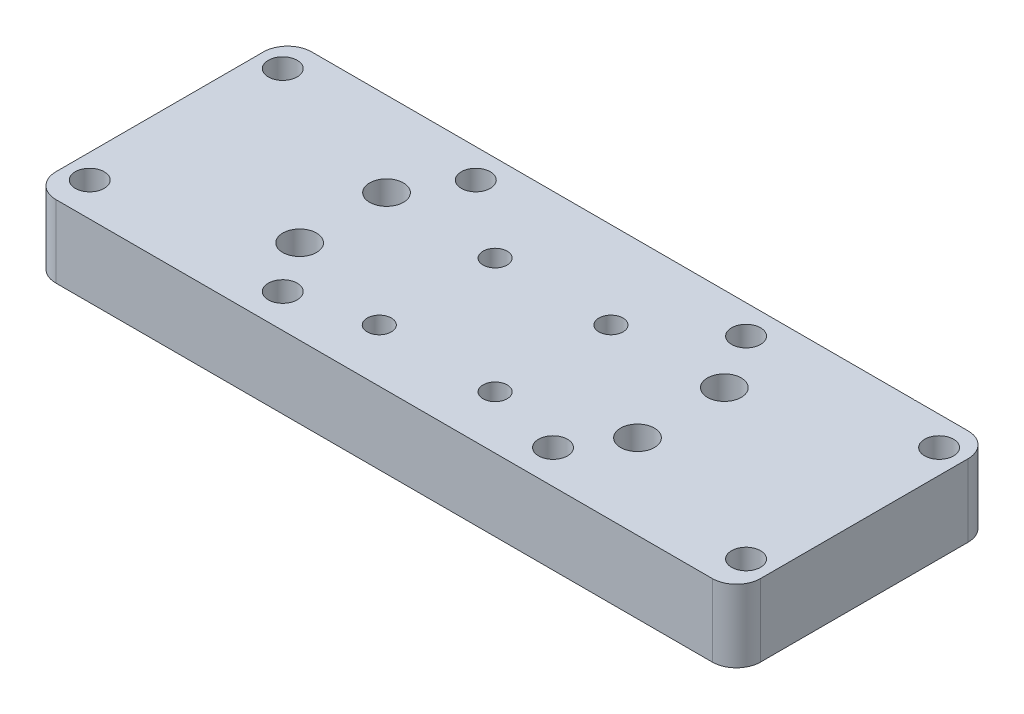
ISO-10303-21;
HEADER;
FILE_DESCRIPTION(('STEP AP214'),'2;1');
FILE_NAME('part.step','',(''),(''),'','','');
FILE_SCHEMA(('AUTOMOTIVE_DESIGN { 1 0 10303 214 1 1 1 1 }'));
ENDSEC;
DATA;
#1=APPLICATION_CONTEXT('core data for automotive mechanical design processes');
#2=APPLICATION_PROTOCOL_DEFINITION('international standard','automotive_design',2000,#1);
#3=PRODUCT_CONTEXT('',#1,'mechanical');
#4=PRODUCT('Part','Part','',(#3));
#5=PRODUCT_RELATED_PRODUCT_CATEGORY('part','',(#4));
#6=PRODUCT_DEFINITION_FORMATION('','',#4);
#7=PRODUCT_DEFINITION_CONTEXT('part definition',#1,'design');
#8=PRODUCT_DEFINITION('design','',#6,#7);
#9=PRODUCT_DEFINITION_SHAPE('','',#8);
#10=(LENGTH_UNIT() NAMED_UNIT(*) SI_UNIT(.MILLI.,.METRE.));
#11=(NAMED_UNIT(*) PLANE_ANGLE_UNIT() SI_UNIT($,.RADIAN.));
#12=(NAMED_UNIT(*) SI_UNIT($,.STERADIAN.) SOLID_ANGLE_UNIT());
#13=UNCERTAINTY_MEASURE_WITH_UNIT(LENGTH_MEASURE(1.E-05),#10,'distance_accuracy_value','');
#14=(GEOMETRIC_REPRESENTATION_CONTEXT(3) GLOBAL_UNCERTAINTY_ASSIGNED_CONTEXT((#13)) GLOBAL_UNIT_ASSIGNED_CONTEXT((#10,
#11,#12)) REPRESENTATION_CONTEXT('',''));
#15=CARTESIAN_POINT('',(0.,0.,0.));
#16=DIRECTION('',(0.,0.,1.));
#17=DIRECTION('',(1.,0.,0.));
#18=AXIS2_PLACEMENT_3D('',#15,#16,#17);
#19=CARTESIAN_POINT('',(0.,0.,0.));
#20=DIRECTION('',(0.,1.,0.));
#21=DIRECTION('',(0.,0.,1.));
#22=AXIS2_PLACEMENT_3D('',#19,#20,#21);
#23=PLANE('',#22);
#24=CARTESIAN_POINT('',(108.,0.,-27.5));
#25=DIRECTION('',(0.,1.,0.));
#26=DIRECTION('',(0.,0.,1.));
#27=AXIS2_PLACEMENT_3D('',#24,#25,#26);
#28=CIRCLE('',#27,3.50000000000001);
#29=CARTESIAN_POINT('',(108.,0.,-24.));
#30=VERTEX_POINT('',#29);
#31=EDGE_CURVE('E213',#30,#30,#28,.T.);
#32=ORIENTED_EDGE('',*,*,#31,.T.);
#33=EDGE_LOOP('',(#32));
#34=FACE_BOUND('',#33,.T.);
#35=CARTESIAN_POINT('',(108.,0.,-45.5));
#36=DIRECTION('',(0.,1.,0.));
#37=DIRECTION('',(0.,0.,1.));
#38=AXIS2_PLACEMENT_3D('',#35,#36,#37);
#39=CIRCLE('',#38,3.50000000000001);
#40=CARTESIAN_POINT('',(108.,0.,-42.));
#41=VERTEX_POINT('',#40);
#42=EDGE_CURVE('E216',#41,#41,#39,.T.);
#43=ORIENTED_EDGE('',*,*,#42,.T.);
#44=EDGE_LOOP('',(#43));
#45=FACE_BOUND('',#44,.T.);
#46=CARTESIAN_POINT('',(38.,0.,-27.5));
#47=DIRECTION('',(0.,1.,0.));
#48=DIRECTION('',(0.,0.,1.));
#49=AXIS2_PLACEMENT_3D('',#46,#47,#48);
#50=CIRCLE('',#49,3.5);
#51=CARTESIAN_POINT('',(38.,0.,-24.));
#52=VERTEX_POINT('',#51);
#53=EDGE_CURVE('E219',#52,#52,#50,.T.);
#54=ORIENTED_EDGE('',*,*,#53,.T.);
#55=EDGE_LOOP('',(#54));
#56=FACE_BOUND('',#55,.T.);
#57=CARTESIAN_POINT('',(38.,0.,-45.5));
#58=DIRECTION('',(0.,1.,0.));
#59=DIRECTION('',(0.,0.,1.));
#60=AXIS2_PLACEMENT_3D('',#57,#58,#59);
#61=CIRCLE('',#60,3.5);
#62=CARTESIAN_POINT('',(38.,0.,-42.));
#63=VERTEX_POINT('',#62);
#64=EDGE_CURVE('E222',#63,#63,#61,.T.);
#65=ORIENTED_EDGE('',*,*,#64,.T.);
#66=EDGE_LOOP('',(#65));
#67=FACE_BOUND('',#66,.T.);
#68=CARTESIAN_POINT('',(85.,0.,-21.));
#69=DIRECTION('',(0.,1.,0.));
#70=DIRECTION('',(0.,0.,1.));
#71=AXIS2_PLACEMENT_3D('',#68,#69,#70);
#72=CIRCLE('',#71,2.5);
#73=CARTESIAN_POINT('',(85.,0.,-18.5));
#74=VERTEX_POINT('',#73);
#75=EDGE_CURVE('E225',#74,#74,#72,.T.);
#76=ORIENTED_EDGE('',*,*,#75,.T.);
#77=EDGE_LOOP('',(#76));
#78=FACE_BOUND('',#77,.T.);
#79=CARTESIAN_POINT('',(61.,0.,-21.));
#80=DIRECTION('',(0.,1.,0.));
#81=DIRECTION('',(0.,0.,1.));
#82=AXIS2_PLACEMENT_3D('',#79,#80,#81);
#83=CIRCLE('',#82,2.5);
#84=CARTESIAN_POINT('',(61.,0.,-18.5));
#85=VERTEX_POINT('',#84);
#86=EDGE_CURVE('E234',#85,#85,#83,.T.);
#87=ORIENTED_EDGE('',*,*,#86,.T.);
#88=EDGE_LOOP('',(#87));
#89=FACE_BOUND('',#88,.T.);
#90=CARTESIAN_POINT('',(85.,0.,-45.));
#91=DIRECTION('',(0.,1.,0.));
#92=DIRECTION('',(0.,0.,1.));
#93=AXIS2_PLACEMENT_3D('',#90,#91,#92);
#94=CIRCLE('',#93,2.5);
#95=CARTESIAN_POINT('',(85.,0.,-42.5));
#96=VERTEX_POINT('',#95);
#97=EDGE_CURVE('E228',#96,#96,#94,.T.);
#98=ORIENTED_EDGE('',*,*,#97,.T.);
#99=EDGE_LOOP('',(#98));
#100=FACE_BOUND('',#99,.T.);
#101=CARTESIAN_POINT('',(61.,0.,-45.));
#102=DIRECTION('',(0.,1.,0.));
#103=DIRECTION('',(0.,0.,1.));
#104=AXIS2_PLACEMENT_3D('',#101,#102,#103);
#105=CIRCLE('',#104,2.5);
#106=CARTESIAN_POINT('',(61.,0.,-42.5));
#107=VERTEX_POINT('',#106);
#108=EDGE_CURVE('E231',#107,#107,#105,.T.);
#109=ORIENTED_EDGE('',*,*,#108,.T.);
#110=EDGE_LOOP('',(#109));
#111=FACE_BOUND('',#110,.T.);
#112=CARTESIAN_POINT('',(5.,0.,-57.));
#113=DIRECTION('',(0.,1.,0.));
#114=DIRECTION('',(0.,0.,1.));
#115=AXIS2_PLACEMENT_3D('',#112,#113,#114);
#116=CIRCLE('',#115,3.);
#117=CARTESIAN_POINT('',(5.,0.,-54.));
#118=VERTEX_POINT('',#117);
#119=EDGE_CURVE('E262',#118,#118,#116,.T.);
#120=ORIENTED_EDGE('',*,*,#119,.T.);
#121=EDGE_LOOP('',(#120));
#122=FACE_BOUND('',#121,.T.);
#123=CARTESIAN_POINT('',(45.,0.,-57.));
#124=DIRECTION('',(0.,1.,0.));
#125=DIRECTION('',(0.,0.,1.));
#126=AXIS2_PLACEMENT_3D('',#123,#124,#125);
#127=CIRCLE('',#126,3.);
#128=CARTESIAN_POINT('',(45.,0.,-54.));
#129=VERTEX_POINT('',#128);
#130=EDGE_CURVE('E259',#129,#129,#127,.T.);
#131=ORIENTED_EDGE('',*,*,#130,.T.);
#132=EDGE_LOOP('',(#131));
#133=FACE_BOUND('',#132,.T.);
#134=CARTESIAN_POINT('',(5.,0.,-17.));
#135=DIRECTION('',(0.,1.,0.));
#136=DIRECTION('',(0.,0.,1.));
#137=AXIS2_PLACEMENT_3D('',#134,#135,#136);
#138=CIRCLE('',#137,3.);
#139=CARTESIAN_POINT('',(5.,0.,-14.));
#140=VERTEX_POINT('',#139);
#141=EDGE_CURVE('E256',#140,#140,#138,.T.);
#142=ORIENTED_EDGE('',*,*,#141,.T.);
#143=EDGE_LOOP('',(#142));
#144=FACE_BOUND('',#143,.T.);
#145=CARTESIAN_POINT('',(45.,0.,-17.));
#146=DIRECTION('',(0.,1.,0.));
#147=DIRECTION('',(0.,0.,1.));
#148=AXIS2_PLACEMENT_3D('',#145,#146,#147);
#149=CIRCLE('',#148,3.);
#150=CARTESIAN_POINT('',(45.,0.,-14.));
#151=VERTEX_POINT('',#150);
#152=EDGE_CURVE('E253',#151,#151,#149,.T.);
#153=ORIENTED_EDGE('',*,*,#152,.T.);
#154=EDGE_LOOP('',(#153));
#155=FACE_BOUND('',#154,.T.);
#156=CARTESIAN_POINT('',(101.,0.,-57.));
#157=DIRECTION('',(0.,1.,0.));
#158=DIRECTION('',(0.,0.,1.));
#159=AXIS2_PLACEMENT_3D('',#156,#157,#158);
#160=CIRCLE('',#159,3.00000000000001);
#161=CARTESIAN_POINT('',(101.,0.,-54.));
#162=VERTEX_POINT('',#161);
#163=EDGE_CURVE('E247',#162,#162,#160,.T.);
#164=ORIENTED_EDGE('',*,*,#163,.T.);
#165=EDGE_LOOP('',(#164));
#166=FACE_BOUND('',#165,.T.);
#167=CARTESIAN_POINT('',(101.,0.,-17.));
#168=DIRECTION('',(0.,1.,0.));
#169=DIRECTION('',(0.,0.,1.));
#170=AXIS2_PLACEMENT_3D('',#167,#168,#169);
#171=CIRCLE('',#170,3.00000000000001);
#172=CARTESIAN_POINT('',(101.,0.,-14.));
#173=VERTEX_POINT('',#172);
#174=EDGE_CURVE('E276',#173,#173,#171,.T.);
#175=ORIENTED_EDGE('',*,*,#174,.T.);
#176=EDGE_LOOP('',(#175));
#177=FACE_BOUND('',#176,.T.);
#178=CARTESIAN_POINT('',(141.,0.,-17.));
#179=DIRECTION('',(0.,1.,0.));
#180=DIRECTION('',(0.,0.,1.));
#181=AXIS2_PLACEMENT_3D('',#178,#179,#180);
#182=CIRCLE('',#181,2.99999999999999);
#183=CARTESIAN_POINT('',(141.,0.,-14.));
#184=VERTEX_POINT('',#183);
#185=EDGE_CURVE('E279',#184,#184,#182,.T.);
#186=ORIENTED_EDGE('',*,*,#185,.T.);
#187=EDGE_LOOP('',(#186));
#188=FACE_BOUND('',#187,.T.);
#189=CARTESIAN_POINT('',(141.,0.,-57.));
#190=DIRECTION('',(0.,1.,0.));
#191=DIRECTION('',(0.,0.,1.));
#192=AXIS2_PLACEMENT_3D('',#189,#190,#191);
#193=CIRCLE('',#192,2.99999999999999);
#194=CARTESIAN_POINT('',(141.,0.,-54.));
#195=VERTEX_POINT('',#194);
#196=EDGE_CURVE('E242',#195,#195,#193,.T.);
#197=ORIENTED_EDGE('',*,*,#196,.T.);
#198=EDGE_LOOP('',(#197));
#199=FACE_BOUND('',#198,.T.);
#200=DIRECTION('',(-1.,0.,0.));
#201=VECTOR('',#200,1.);
#202=CARTESIAN_POINT('',(160.,0.,-63.));
#203=LINE('',#202,#201);
#204=CARTESIAN_POINT('',(141.,0.,-63.));
#205=VERTEX_POINT('',#204);
#206=CARTESIAN_POINT('',(130.,0.,-63.));
#207=VERTEX_POINT('',#206);
#208=EDGE_CURVE('E249',#205,#207,#203,.T.);
#209=ORIENTED_EDGE('',*,*,#208,.F.);
#210=CARTESIAN_POINT('',(141.,0.,-58.));
#211=DIRECTION('',(0.,1.,0.));
#212=DIRECTION('',(0.,0.,1.));
#213=AXIS2_PLACEMENT_3D('',#210,#211,#212);
#214=CIRCLE('',#213,5.);
#215=CARTESIAN_POINT('',(146.,0.,-58.));
#216=VERTEX_POINT('',#215);
#217=EDGE_CURVE('E294',#205,#216,#214,.F.);
#218=ORIENTED_EDGE('',*,*,#217,.T.);
#219=DIRECTION('',(0.,0.,-1.));
#220=VECTOR('',#219,1.);
#221=CARTESIAN_POINT('',(146.,0.,-10.));
#222=LINE('',#221,#220);
#223=CARTESIAN_POINT('',(146.,0.,-15.));
#224=VERTEX_POINT('',#223);
#225=EDGE_CURVE('E239',#224,#216,#222,.T.);
#226=ORIENTED_EDGE('',*,*,#225,.F.);
#227=CARTESIAN_POINT('',(141.,0.,-15.));
#228=DIRECTION('',(0.,1.,0.));
#229=DIRECTION('',(0.,0.,1.));
#230=AXIS2_PLACEMENT_3D('',#227,#228,#229);
#231=CIRCLE('',#230,5.);
#232=CARTESIAN_POINT('',(141.,0.,-10.));
#233=VERTEX_POINT('',#232);
#234=EDGE_CURVE('E292',#224,#233,#231,.F.);
#235=ORIENTED_EDGE('',*,*,#234,.T.);
#236=DIRECTION('',(-1.,0.,0.));
#237=VECTOR('',#236,1.);
#238=CARTESIAN_POINT('',(0.,0.,-10.));
#239=LINE('',#238,#237);
#240=CARTESIAN_POINT('',(5.,0.,-10.));
#241=VERTEX_POINT('',#240);
#242=EDGE_CURVE('E251',#233,#241,#239,.T.);
#243=ORIENTED_EDGE('',*,*,#242,.T.);
#244=CARTESIAN_POINT('',(5.,0.,-15.));
#245=DIRECTION('',(0.,1.,0.));
#246=DIRECTION('',(0.,0.,1.));
#247=AXIS2_PLACEMENT_3D('',#244,#245,#246);
#248=CIRCLE('',#247,5.);
#249=CARTESIAN_POINT('',(0.,0.,-15.));
#250=VERTEX_POINT('',#249);
#251=EDGE_CURVE('E59',#241,#250,#248,.F.);
#252=ORIENTED_EDGE('',*,*,#251,.T.);
#253=DIRECTION('',(0.,0.,1.));
#254=VECTOR('',#253,1.);
#255=CARTESIAN_POINT('',(0.,0.,-63.));
#256=LINE('',#255,#254);
#257=CARTESIAN_POINT('',(0.,0.,-58.));
#258=VERTEX_POINT('',#257);
#259=EDGE_CURVE('E237',#258,#250,#256,.T.);
#260=ORIENTED_EDGE('',*,*,#259,.F.);
#261=CARTESIAN_POINT('',(5.,0.,-58.));
#262=DIRECTION('',(0.,1.,0.));
#263=DIRECTION('',(0.,0.,1.));
#264=AXIS2_PLACEMENT_3D('',#261,#262,#263);
#265=CIRCLE('',#264,5.);
#266=CARTESIAN_POINT('',(5.,0.,-63.));
#267=VERTEX_POINT('',#266);
#268=EDGE_CURVE('E53',#258,#267,#265,.F.);
#269=ORIENTED_EDGE('',*,*,#268,.T.);
#270=DIRECTION('',(1.,0.,0.));
#271=VECTOR('',#270,1.);
#272=CARTESIAN_POINT('',(0.,0.,-63.));
#273=LINE('',#272,#271);
#274=CARTESIAN_POINT('',(129.9,0.,-63.));
#275=VERTEX_POINT('',#274);
#276=EDGE_CURVE('E125',#267,#275,#273,.T.);
#277=ORIENTED_EDGE('',*,*,#276,.T.);
#278=CARTESIAN_POINT('',(129.9,0.,-62.9));
#279=DIRECTION('',(0.,1.,0.));
#280=DIRECTION('',(0.,0.,1.));
#281=AXIS2_PLACEMENT_3D('',#278,#279,#280);
#282=CIRCLE('',#281,0.1);
#283=CARTESIAN_POINT('',(130.,0.,-62.9));
#284=VERTEX_POINT('',#283);
#285=EDGE_CURVE('E270',#275,#284,#282,.F.);
#286=ORIENTED_EDGE('',*,*,#285,.T.);
#287=DIRECTION('',(0.,0.,-1.));
#288=VECTOR('',#287,1.);
#289=CARTESIAN_POINT('',(130.,0.,-10.));
#290=LINE('',#289,#288);
#291=EDGE_CURVE('E243',#284,#207,#290,.T.);
#292=ORIENTED_EDGE('',*,*,#291,.T.);
#293=EDGE_LOOP('',(#209,#218,#226,#235,#243,#252,#260,#269,#277,#286,#292));
#294=FACE_BOUND('',#293,.T.);
#295=ADVANCED_FACE('F38',(#34,#45,#56,#67,#78,#89,#100,#111,#122,#133,#144,#155,#166,#177,#188,
#199,#294),#23,.F.);
#296=CARTESIAN_POINT('',(0.,0.,-10.));
#297=DIRECTION('',(0.,0.,-1.));
#298=DIRECTION('',(-1.,0.,0.));
#299=AXIS2_PLACEMENT_3D('',#296,#297,#298);
#300=PLANE('',#299);
#301=ORIENTED_EDGE('',*,*,#242,.F.);
#302=DIRECTION('',(0.,-1.,0.));
#303=VECTOR('',#302,1.);
#304=CARTESIAN_POINT('',(141.,10.,-10.));
#305=LINE('',#304,#303);
#306=CARTESIAN_POINT('',(141.,15.,-10.));
#307=VERTEX_POINT('',#306);
#308=EDGE_CURVE('E298',#233,#307,#305,.F.);
#309=ORIENTED_EDGE('',*,*,#308,.T.);
#310=DIRECTION('',(1.,0.,0.));
#311=VECTOR('',#310,1.);
#312=CARTESIAN_POINT('',(0.,15.,-10.));
#313=LINE('',#312,#311);
#314=CARTESIAN_POINT('',(5.,15.,-10.));
#315=VERTEX_POINT('',#314);
#316=EDGE_CURVE('E153',#315,#307,#313,.T.);
#317=ORIENTED_EDGE('',*,*,#316,.F.);
#318=DIRECTION('',(0.,1.,0.));
#319=VECTOR('',#318,1.);
#320=CARTESIAN_POINT('',(5.,0.,-10.));
#321=LINE('',#320,#319);
#322=EDGE_CURVE('E296',#315,#241,#321,.F.);
#323=ORIENTED_EDGE('',*,*,#322,.T.);
#324=EDGE_LOOP('',(#301,#309,#317,#323));
#325=FACE_BOUND('',#324,.T.);
#326=ADVANCED_FACE('F309',(#325),#300,.F.);
#327=CARTESIAN_POINT('',(160.,10.,-63.));
#328=DIRECTION('',(0.,0.,1.));
#329=DIRECTION('',(1.,0.,0.));
#330=AXIS2_PLACEMENT_3D('',#327,#328,#329);
#331=PLANE('',#330);
#332=DIRECTION('',(0.,1.,0.));
#333=VECTOR('',#332,1.);
#334=CARTESIAN_POINT('',(130.,10.,-63.));
#335=LINE('',#334,#333);
#336=CARTESIAN_POINT('',(130.,15.,-63.));
#337=VERTEX_POINT('',#336);
#338=EDGE_CURVE('E246',#207,#337,#335,.T.);
#339=ORIENTED_EDGE('',*,*,#338,.T.);
#340=DIRECTION('',(-1.,0.,0.));
#341=VECTOR('',#340,1.);
#342=CARTESIAN_POINT('',(0.,15.,-63.));
#343=LINE('',#342,#341);
#344=CARTESIAN_POINT('',(141.,15.,-63.));
#345=VERTEX_POINT('',#344);
#346=EDGE_CURVE('E165',#345,#337,#343,.T.);
#347=ORIENTED_EDGE('',*,*,#346,.F.);
#348=DIRECTION('',(0.,1.,0.));
#349=VECTOR('',#348,1.);
#350=CARTESIAN_POINT('',(141.,0.,-63.));
#351=LINE('',#350,#349);
#352=EDGE_CURVE('E288',#345,#205,#351,.F.);
#353=ORIENTED_EDGE('',*,*,#352,.T.);
#354=ORIENTED_EDGE('',*,*,#208,.T.);
#355=EDGE_LOOP('',(#339,#347,#353,#354));
#356=FACE_BOUND('',#355,.T.);
#357=ADVANCED_FACE('F326',(#356),#331,.F.);
#358=CARTESIAN_POINT('',(5.,10.,-57.));
#359=DIRECTION('',(0.,-1.,0.));
#360=DIRECTION('',(0.,0.,-1.));
#361=AXIS2_PLACEMENT_3D('',#358,#359,#360);
#362=CYLINDRICAL_SURFACE('',#361,3.);
#363=ORIENTED_EDGE('',*,*,#119,.F.);
#364=EDGE_LOOP('',(#363));
#365=FACE_BOUND('',#364,.T.);
#366=CARTESIAN_POINT('',(5.,15.,-57.));
#367=DIRECTION('',(0.,1.,0.));
#368=DIRECTION('',(0.,0.,1.));
#369=AXIS2_PLACEMENT_3D('',#366,#367,#368);
#370=CIRCLE('',#369,3.);
#371=CARTESIAN_POINT('',(5.,15.,-54.));
#372=VERTEX_POINT('',#371);
#373=EDGE_CURVE('E210',#372,#372,#370,.F.);
#374=ORIENTED_EDGE('',*,*,#373,.F.);
#375=EDGE_LOOP('',(#374));
#376=FACE_BOUND('',#375,.T.);
#377=ADVANCED_FACE('F357',(#365,#376),#362,.F.);
#378=CARTESIAN_POINT('',(45.,10.,-57.));
#379=DIRECTION('',(0.,-1.,0.));
#380=DIRECTION('',(0.,0.,-1.));
#381=AXIS2_PLACEMENT_3D('',#378,#379,#380);
#382=CYLINDRICAL_SURFACE('',#381,3.);
#383=ORIENTED_EDGE('',*,*,#130,.F.);
#384=EDGE_LOOP('',(#383));
#385=FACE_BOUND('',#384,.T.);
#386=CARTESIAN_POINT('',(45.,15.,-57.));
#387=DIRECTION('',(0.,1.,0.));
#388=DIRECTION('',(0.,0.,1.));
#389=AXIS2_PLACEMENT_3D('',#386,#387,#388);
#390=CIRCLE('',#389,3.);
#391=CARTESIAN_POINT('',(45.,15.,-54.));
#392=VERTEX_POINT('',#391);
#393=EDGE_CURVE('E192',#392,#392,#390,.F.);
#394=ORIENTED_EDGE('',*,*,#393,.F.);
#395=EDGE_LOOP('',(#394));
#396=FACE_BOUND('',#395,.T.);
#397=ADVANCED_FACE('F360',(#385,#396),#382,.F.);
#398=CARTESIAN_POINT('',(5.,10.,-17.));
#399=DIRECTION('',(0.,-1.,0.));
#400=DIRECTION('',(0.,0.,-1.));
#401=AXIS2_PLACEMENT_3D('',#398,#399,#400);
#402=CYLINDRICAL_SURFACE('',#401,3.);
#403=ORIENTED_EDGE('',*,*,#141,.F.);
#404=EDGE_LOOP('',(#403));
#405=FACE_BOUND('',#404,.T.);
#406=CARTESIAN_POINT('',(5.,15.,-17.));
#407=DIRECTION('',(0.,1.,0.));
#408=DIRECTION('',(0.,0.,1.));
#409=AXIS2_PLACEMENT_3D('',#406,#407,#408);
#410=CIRCLE('',#409,3.);
#411=CARTESIAN_POINT('',(5.,15.,-14.));
#412=VERTEX_POINT('',#411);
#413=EDGE_CURVE('E145',#412,#412,#410,.F.);
#414=ORIENTED_EDGE('',*,*,#413,.F.);
#415=EDGE_LOOP('',(#414));
#416=FACE_BOUND('',#415,.T.);
#417=ADVANCED_FACE('F364',(#405,#416),#402,.F.);
#418=CARTESIAN_POINT('',(45.,10.,-17.));
#419=DIRECTION('',(0.,-1.,0.));
#420=DIRECTION('',(0.,0.,-1.));
#421=AXIS2_PLACEMENT_3D('',#418,#419,#420);
#422=CYLINDRICAL_SURFACE('',#421,3.);
#423=ORIENTED_EDGE('',*,*,#152,.F.);
#424=EDGE_LOOP('',(#423));
#425=FACE_BOUND('',#424,.T.);
#426=CARTESIAN_POINT('',(45.,15.,-17.));
#427=DIRECTION('',(0.,1.,0.));
#428=DIRECTION('',(0.,0.,1.));
#429=AXIS2_PLACEMENT_3D('',#426,#427,#428);
#430=CIRCLE('',#429,3.);
#431=CARTESIAN_POINT('',(45.,15.,-14.));
#432=VERTEX_POINT('',#431);
#433=EDGE_CURVE('E189',#432,#432,#430,.F.);
#434=ORIENTED_EDGE('',*,*,#433,.F.);
#435=EDGE_LOOP('',(#434));
#436=FACE_BOUND('',#435,.T.);
#437=ADVANCED_FACE('F343',(#425,#436),#422,.F.);
#438=CARTESIAN_POINT('',(0.,10.,-63.));
#439=DIRECTION('',(0.,0.,-1.));
#440=DIRECTION('',(-1.,0.,0.));
#441=AXIS2_PLACEMENT_3D('',#438,#439,#440);
#442=PLANE('',#441);
#443=ORIENTED_EDGE('',*,*,#276,.F.);
#444=DIRECTION('',(0.,-1.,0.));
#445=VECTOR('',#444,1.);
#446=CARTESIAN_POINT('',(5.,10.,-63.));
#447=LINE('',#446,#445);
#448=CARTESIAN_POINT('',(5.,15.,-63.));
#449=VERTEX_POINT('',#448);
#450=EDGE_CURVE('E11',#267,#449,#447,.F.);
#451=ORIENTED_EDGE('',*,*,#450,.T.);
#452=DIRECTION('',(-1.,0.,0.));
#453=VECTOR('',#452,1.);
#454=CARTESIAN_POINT('',(0.,15.,-63.));
#455=LINE('',#454,#453);
#456=CARTESIAN_POINT('',(129.9,15.,-63.));
#457=VERTEX_POINT('',#456);
#458=EDGE_CURVE('E124',#457,#449,#455,.T.);
#459=ORIENTED_EDGE('',*,*,#458,.F.);
#460=DIRECTION('',(0.,-1.,0.));
#461=VECTOR('',#460,1.);
#462=CARTESIAN_POINT('',(129.9,0.,-63.));
#463=LINE('',#462,#461);
#464=EDGE_CURVE('E268',#457,#275,#463,.T.);
#465=ORIENTED_EDGE('',*,*,#464,.T.);
#466=EDGE_LOOP('',(#443,#451,#459,#465));
#467=FACE_BOUND('',#466,.T.);
#468=ADVANCED_FACE('F121',(#467),#442,.T.);
#469=CARTESIAN_POINT('',(129.9,10.,-62.9));
#470=DIRECTION('',(0.,1.,0.));
#471=DIRECTION('',(0.,0.,1.));
#472=AXIS2_PLACEMENT_3D('',#469,#470,#471);
#473=CYLINDRICAL_SURFACE('',#472,0.1);
#474=ORIENTED_EDGE('',*,*,#464,.F.);
#475=CARTESIAN_POINT('',(129.9,15.,-62.9));
#476=DIRECTION('',(0.,1.,0.));
#477=DIRECTION('',(0.,0.,1.));
#478=AXIS2_PLACEMENT_3D('',#475,#476,#477);
#479=CIRCLE('',#478,0.1);
#480=CARTESIAN_POINT('',(130.,15.,-62.9));
#481=VERTEX_POINT('',#480);
#482=EDGE_CURVE('E141',#481,#457,#479,.T.);
#483=ORIENTED_EDGE('',*,*,#482,.F.);
#484=DIRECTION('',(0.,-1.,0.));
#485=VECTOR('',#484,1.);
#486=CARTESIAN_POINT('',(130.,10.,-62.9));
#487=LINE('',#486,#485);
#488=EDGE_CURVE('E266',#284,#481,#487,.F.);
#489=ORIENTED_EDGE('',*,*,#488,.F.);
#490=ORIENTED_EDGE('',*,*,#285,.F.);
#491=EDGE_LOOP('',(#474,#483,#489,#490));
#492=FACE_BOUND('',#491,.T.);
#493=ADVANCED_FACE('F334',(#492),#473,.T.);
#494=CARTESIAN_POINT('',(130.,0.,0.));
#495=DIRECTION('',(1.,0.,0.));
#496=DIRECTION('',(0.,0.,-1.));
#497=AXIS2_PLACEMENT_3D('',#494,#495,#496);
#498=PLANE('',#497);
#499=ORIENTED_EDGE('',*,*,#488,.T.);
#500=DIRECTION('',(0.,0.,1.));
#501=VECTOR('',#500,1.);
#502=CARTESIAN_POINT('',(130.,15.,0.));
#503=LINE('',#502,#501);
#504=EDGE_CURVE('E168',#337,#481,#503,.T.);
#505=ORIENTED_EDGE('',*,*,#504,.F.);
#506=ORIENTED_EDGE('',*,*,#338,.F.);
#507=ORIENTED_EDGE('',*,*,#291,.F.);
#508=EDGE_LOOP('',(#499,#505,#506,#507));
#509=FACE_BOUND('',#508,.T.);
#510=ADVANCED_FACE('F332',(#509),#498,.F.);
#511=CARTESIAN_POINT('',(101.,-20.,-57.));
#512=DIRECTION('',(0.,1.,0.));
#513=DIRECTION('',(0.,0.,1.));
#514=AXIS2_PLACEMENT_3D('',#511,#512,#513);
#515=CYLINDRICAL_SURFACE('',#514,3.00000000000001);
#516=ORIENTED_EDGE('',*,*,#163,.F.);
#517=EDGE_LOOP('',(#516));
#518=FACE_BOUND('',#517,.T.);
#519=CARTESIAN_POINT('',(101.,15.,-57.));
#520=DIRECTION('',(0.,1.,0.));
#521=DIRECTION('',(0.,0.,1.));
#522=AXIS2_PLACEMENT_3D('',#519,#520,#521);
#523=CIRCLE('',#522,3.00000000000001);
#524=CARTESIAN_POINT('',(101.,15.,-54.));
#525=VERTEX_POINT('',#524);
#526=EDGE_CURVE('E183',#525,#525,#523,.F.);
#527=ORIENTED_EDGE('',*,*,#526,.F.);
#528=EDGE_LOOP('',(#527));
#529=FACE_BOUND('',#528,.T.);
#530=ADVANCED_FACE('F341',(#518,#529),#515,.F.);
#531=CARTESIAN_POINT('',(101.,-20.,-17.));
#532=DIRECTION('',(0.,1.,0.));
#533=DIRECTION('',(0.,0.,1.));
#534=AXIS2_PLACEMENT_3D('',#531,#532,#533);
#535=CYLINDRICAL_SURFACE('',#534,3.00000000000001);
#536=ORIENTED_EDGE('',*,*,#174,.F.);
#537=EDGE_LOOP('',(#536));
#538=FACE_BOUND('',#537,.T.);
#539=CARTESIAN_POINT('',(101.,15.,-17.));
#540=DIRECTION('',(0.,1.,0.));
#541=DIRECTION('',(0.,0.,1.));
#542=AXIS2_PLACEMENT_3D('',#539,#540,#541);
#543=CIRCLE('',#542,3.00000000000001);
#544=CARTESIAN_POINT('',(101.,15.,-14.));
#545=VERTEX_POINT('',#544);
#546=EDGE_CURVE('E186',#545,#545,#543,.F.);
#547=ORIENTED_EDGE('',*,*,#546,.F.);
#548=EDGE_LOOP('',(#547));
#549=FACE_BOUND('',#548,.T.);
#550=ADVANCED_FACE('F406',(#538,#549),#535,.F.);
#551=CARTESIAN_POINT('',(141.,-20.,-17.));
#552=DIRECTION('',(0.,1.,0.));
#553=DIRECTION('',(0.,0.,1.));
#554=AXIS2_PLACEMENT_3D('',#551,#552,#553);
#555=CYLINDRICAL_SURFACE('',#554,2.99999999999999);
#556=ORIENTED_EDGE('',*,*,#185,.F.);
#557=EDGE_LOOP('',(#556));
#558=FACE_BOUND('',#557,.T.);
#559=CARTESIAN_POINT('',(141.,15.,-17.));
#560=DIRECTION('',(0.,1.,0.));
#561=DIRECTION('',(0.,0.,1.));
#562=AXIS2_PLACEMENT_3D('',#559,#560,#561);
#563=CIRCLE('',#562,2.99999999999999);
#564=CARTESIAN_POINT('',(141.,15.,-14.));
#565=VERTEX_POINT('',#564);
#566=EDGE_CURVE('E142',#565,#565,#563,.F.);
#567=ORIENTED_EDGE('',*,*,#566,.F.);
#568=EDGE_LOOP('',(#567));
#569=FACE_BOUND('',#568,.T.);
#570=ADVANCED_FACE('F398',(#558,#569),#555,.F.);
#571=CARTESIAN_POINT('',(141.,-20.,-57.));
#572=DIRECTION('',(0.,1.,0.));
#573=DIRECTION('',(0.,0.,1.));
#574=AXIS2_PLACEMENT_3D('',#571,#572,#573);
#575=CYLINDRICAL_SURFACE('',#574,2.99999999999999);
#576=ORIENTED_EDGE('',*,*,#196,.F.);
#577=EDGE_LOOP('',(#576));
#578=FACE_BOUND('',#577,.T.);
#579=CARTESIAN_POINT('',(141.,15.,-57.));
#580=DIRECTION('',(0.,1.,0.));
#581=DIRECTION('',(0.,0.,1.));
#582=AXIS2_PLACEMENT_3D('',#579,#580,#581);
#583=CIRCLE('',#582,2.99999999999999);
#584=CARTESIAN_POINT('',(141.,15.,-54.));
#585=VERTEX_POINT('',#584);
#586=EDGE_CURVE('E207',#585,#585,#583,.F.);
#587=ORIENTED_EDGE('',*,*,#586,.F.);
#588=EDGE_LOOP('',(#587));
#589=FACE_BOUND('',#588,.T.);
#590=ADVANCED_FACE('F396',(#578,#589),#575,.F.);
#591=CARTESIAN_POINT('',(146.,0.,0.));
#592=DIRECTION('',(1.,0.,0.));
#593=DIRECTION('',(0.,0.,-1.));
#594=AXIS2_PLACEMENT_3D('',#591,#592,#593);
#595=PLANE('',#594);
#596=ORIENTED_EDGE('',*,*,#225,.T.);
#597=DIRECTION('',(0.,1.,0.));
#598=VECTOR('',#597,1.);
#599=CARTESIAN_POINT('',(146.,10.,-58.));
#600=LINE('',#599,#598);
#601=CARTESIAN_POINT('',(146.,15.,-58.));
#602=VERTEX_POINT('',#601);
#603=EDGE_CURVE('E286',#216,#602,#600,.T.);
#604=ORIENTED_EDGE('',*,*,#603,.T.);
#605=DIRECTION('',(0.,0.,-1.));
#606=VECTOR('',#605,1.);
#607=CARTESIAN_POINT('',(146.,15.,0.));
#608=LINE('',#607,#606);
#609=CARTESIAN_POINT('',(146.,15.,-15.));
#610=VERTEX_POINT('',#609);
#611=EDGE_CURVE('E159',#610,#602,#608,.T.);
#612=ORIENTED_EDGE('',*,*,#611,.F.);
#613=DIRECTION('',(0.,-1.,0.));
#614=VECTOR('',#613,1.);
#615=CARTESIAN_POINT('',(146.,0.,-15.));
#616=LINE('',#615,#614);
#617=EDGE_CURVE('E273',#610,#224,#616,.T.);
#618=ORIENTED_EDGE('',*,*,#617,.T.);
#619=EDGE_LOOP('',(#596,#604,#612,#618));
#620=FACE_BOUND('',#619,.T.);
#621=ADVANCED_FACE('F318',(#620),#595,.T.);
#622=CARTESIAN_POINT('',(0.,0.,0.));
#623=DIRECTION('',(-1.,0.,0.));
#624=DIRECTION('',(0.,0.,1.));
#625=AXIS2_PLACEMENT_3D('',#622,#623,#624);
#626=PLANE('',#625);
#627=ORIENTED_EDGE('',*,*,#259,.T.);
#628=DIRECTION('',(0.,1.,0.));
#629=VECTOR('',#628,1.);
#630=CARTESIAN_POINT('',(0.,10.,-15.));
#631=LINE('',#630,#629);
#632=CARTESIAN_POINT('',(0.,15.,-15.));
#633=VERTEX_POINT('',#632);
#634=EDGE_CURVE('E46',#250,#633,#631,.T.);
#635=ORIENTED_EDGE('',*,*,#634,.T.);
#636=DIRECTION('',(0.,0.,1.));
#637=VECTOR('',#636,1.);
#638=CARTESIAN_POINT('',(0.,15.,0.));
#639=LINE('',#638,#637);
#640=CARTESIAN_POINT('',(0.,15.,-58.));
#641=VERTEX_POINT('',#640);
#642=EDGE_CURVE('E134',#641,#633,#639,.T.);
#643=ORIENTED_EDGE('',*,*,#642,.F.);
#644=DIRECTION('',(0.,-1.,0.));
#645=VECTOR('',#644,1.);
#646=CARTESIAN_POINT('',(0.,0.,-58.));
#647=LINE('',#646,#645);
#648=EDGE_CURVE('E130',#641,#258,#647,.T.);
#649=ORIENTED_EDGE('',*,*,#648,.T.);
#650=EDGE_LOOP('',(#627,#635,#643,#649));
#651=FACE_BOUND('',#650,.T.);
#652=ADVANCED_FACE('F302',(#651),#626,.T.);
#653=CARTESIAN_POINT('',(141.,0.,-58.));
#654=DIRECTION('',(0.,-1.,0.));
#655=DIRECTION('',(0.,0.,-1.));
#656=AXIS2_PLACEMENT_3D('',#653,#654,#655);
#657=CYLINDRICAL_SURFACE('',#656,5.);
#658=ORIENTED_EDGE('',*,*,#217,.F.);
#659=ORIENTED_EDGE('',*,*,#352,.F.);
#660=CARTESIAN_POINT('',(141.,15.,-58.));
#661=DIRECTION('',(0.,1.,0.));
#662=DIRECTION('',(0.,0.,1.));
#663=AXIS2_PLACEMENT_3D('',#660,#661,#662);
#664=CIRCLE('',#663,5.);
#665=EDGE_CURVE('E162',#602,#345,#664,.T.);
#666=ORIENTED_EDGE('',*,*,#665,.F.);
#667=ORIENTED_EDGE('',*,*,#603,.F.);
#668=EDGE_LOOP('',(#658,#659,#666,#667));
#669=FACE_BOUND('',#668,.T.);
#670=ADVANCED_FACE('F324',(#669),#657,.T.);
#671=CARTESIAN_POINT('',(141.,0.,-15.));
#672=DIRECTION('',(0.,1.,0.));
#673=DIRECTION('',(0.,0.,1.));
#674=AXIS2_PLACEMENT_3D('',#671,#672,#673);
#675=CYLINDRICAL_SURFACE('',#674,5.);
#676=ORIENTED_EDGE('',*,*,#617,.F.);
#677=CARTESIAN_POINT('',(141.,15.,-15.));
#678=DIRECTION('',(0.,1.,0.));
#679=DIRECTION('',(0.,0.,1.));
#680=AXIS2_PLACEMENT_3D('',#677,#678,#679);
#681=CIRCLE('',#680,5.);
#682=EDGE_CURVE('E156',#307,#610,#681,.T.);
#683=ORIENTED_EDGE('',*,*,#682,.F.);
#684=ORIENTED_EDGE('',*,*,#308,.F.);
#685=ORIENTED_EDGE('',*,*,#234,.F.);
#686=EDGE_LOOP('',(#676,#683,#684,#685));
#687=FACE_BOUND('',#686,.T.);
#688=ADVANCED_FACE('F314',(#687),#675,.T.);
#689=CARTESIAN_POINT('',(5.,0.,-15.));
#690=DIRECTION('',(0.,-1.,0.));
#691=DIRECTION('',(0.,0.,-1.));
#692=AXIS2_PLACEMENT_3D('',#689,#690,#691);
#693=CYLINDRICAL_SURFACE('',#692,5.);
#694=ORIENTED_EDGE('',*,*,#251,.F.);
#695=ORIENTED_EDGE('',*,*,#322,.F.);
#696=CARTESIAN_POINT('',(5.,15.,-15.));
#697=DIRECTION('',(0.,1.,0.));
#698=DIRECTION('',(0.,0.,1.));
#699=AXIS2_PLACEMENT_3D('',#696,#697,#698);
#700=CIRCLE('',#699,5.);
#701=EDGE_CURVE('E150',#633,#315,#700,.T.);
#702=ORIENTED_EDGE('',*,*,#701,.F.);
#703=ORIENTED_EDGE('',*,*,#634,.F.);
#704=EDGE_LOOP('',(#694,#695,#702,#703));
#705=FACE_BOUND('',#704,.T.);
#706=ADVANCED_FACE('F306',(#705),#693,.T.);
#707=CARTESIAN_POINT('',(5.,0.,-58.));
#708=DIRECTION('',(0.,-1.,0.));
#709=DIRECTION('',(0.,0.,-1.));
#710=AXIS2_PLACEMENT_3D('',#707,#708,#709);
#711=CYLINDRICAL_SURFACE('',#710,5.);
#712=ORIENTED_EDGE('',*,*,#648,.F.);
#713=CARTESIAN_POINT('',(5.,15.,-58.));
#714=DIRECTION('',(0.,1.,0.));
#715=DIRECTION('',(0.,0.,1.));
#716=AXIS2_PLACEMENT_3D('',#713,#714,#715);
#717=CIRCLE('',#716,5.);
#718=EDGE_CURVE('E128',#449,#641,#717,.T.);
#719=ORIENTED_EDGE('',*,*,#718,.F.);
#720=ORIENTED_EDGE('',*,*,#450,.F.);
#721=ORIENTED_EDGE('',*,*,#268,.F.);
#722=EDGE_LOOP('',(#712,#719,#720,#721));
#723=FACE_BOUND('',#722,.T.);
#724=ADVANCED_FACE('F40',(#723),#711,.T.);
#725=CARTESIAN_POINT('',(61.,0.,-21.));
#726=DIRECTION('',(0.,1.,0.));
#727=DIRECTION('',(0.,0.,1.));
#728=AXIS2_PLACEMENT_3D('',#725,#726,#727);
#729=CYLINDRICAL_SURFACE('',#728,2.5);
#730=ORIENTED_EDGE('',*,*,#86,.F.);
#731=EDGE_LOOP('',(#730));
#732=FACE_BOUND('',#731,.T.);
#733=CARTESIAN_POINT('',(61.,15.,-21.));
#734=DIRECTION('',(0.,1.,0.));
#735=DIRECTION('',(0.,0.,1.));
#736=AXIS2_PLACEMENT_3D('',#733,#734,#735);
#737=CIRCLE('',#736,2.5);
#738=CARTESIAN_POINT('',(61.,15.,-18.5));
#739=VERTEX_POINT('',#738);
#740=EDGE_CURVE('E180',#739,#739,#737,.F.);
#741=ORIENTED_EDGE('',*,*,#740,.F.);
#742=EDGE_LOOP('',(#741));
#743=FACE_BOUND('',#742,.T.);
#744=ADVANCED_FACE('F535',(#732,#743),#729,.F.);
#745=CARTESIAN_POINT('',(61.,0.,-45.));
#746=DIRECTION('',(0.,1.,0.));
#747=DIRECTION('',(0.,0.,1.));
#748=AXIS2_PLACEMENT_3D('',#745,#746,#747);
#749=CYLINDRICAL_SURFACE('',#748,2.5);
#750=ORIENTED_EDGE('',*,*,#108,.F.);
#751=EDGE_LOOP('',(#750));
#752=FACE_BOUND('',#751,.T.);
#753=CARTESIAN_POINT('',(61.,15.,-45.));
#754=DIRECTION('',(0.,1.,0.));
#755=DIRECTION('',(0.,0.,1.));
#756=AXIS2_PLACEMENT_3D('',#753,#754,#755);
#757=CIRCLE('',#756,2.5);
#758=CARTESIAN_POINT('',(61.,15.,-42.5));
#759=VERTEX_POINT('',#758);
#760=EDGE_CURVE('E195',#759,#759,#757,.F.);
#761=ORIENTED_EDGE('',*,*,#760,.F.);
#762=EDGE_LOOP('',(#761));
#763=FACE_BOUND('',#762,.T.);
#764=ADVANCED_FACE('F544',(#752,#763),#749,.F.);
#765=CARTESIAN_POINT('',(85.,0.,-45.));
#766=DIRECTION('',(0.,1.,0.));
#767=DIRECTION('',(0.,0.,1.));
#768=AXIS2_PLACEMENT_3D('',#765,#766,#767);
#769=CYLINDRICAL_SURFACE('',#768,2.5);
#770=ORIENTED_EDGE('',*,*,#97,.F.);
#771=EDGE_LOOP('',(#770));
#772=FACE_BOUND('',#771,.T.);
#773=CARTESIAN_POINT('',(85.,15.,-45.));
#774=DIRECTION('',(0.,1.,0.));
#775=DIRECTION('',(0.,0.,1.));
#776=AXIS2_PLACEMENT_3D('',#773,#774,#775);
#777=CIRCLE('',#776,2.5);
#778=CARTESIAN_POINT('',(85.,15.,-42.5));
#779=VERTEX_POINT('',#778);
#780=EDGE_CURVE('E177',#779,#779,#777,.F.);
#781=ORIENTED_EDGE('',*,*,#780,.F.);
#782=EDGE_LOOP('',(#781));
#783=FACE_BOUND('',#782,.T.);
#784=ADVANCED_FACE('F555',(#772,#783),#769,.F.);
#785=CARTESIAN_POINT('',(85.,0.,-21.));
#786=DIRECTION('',(0.,1.,0.));
#787=DIRECTION('',(0.,0.,1.));
#788=AXIS2_PLACEMENT_3D('',#785,#786,#787);
#789=CYLINDRICAL_SURFACE('',#788,2.5);
#790=ORIENTED_EDGE('',*,*,#75,.F.);
#791=EDGE_LOOP('',(#790));
#792=FACE_BOUND('',#791,.T.);
#793=CARTESIAN_POINT('',(85.,15.,-21.));
#794=DIRECTION('',(0.,1.,0.));
#795=DIRECTION('',(0.,0.,1.));
#796=AXIS2_PLACEMENT_3D('',#793,#794,#795);
#797=CIRCLE('',#796,2.5);
#798=CARTESIAN_POINT('',(85.,15.,-18.5));
#799=VERTEX_POINT('',#798);
#800=EDGE_CURVE('E198',#799,#799,#797,.F.);
#801=ORIENTED_EDGE('',*,*,#800,.F.);
#802=EDGE_LOOP('',(#801));
#803=FACE_BOUND('',#802,.T.);
#804=ADVANCED_FACE('F566',(#792,#803),#789,.F.);
#805=CARTESIAN_POINT('',(38.,0.,-45.5));
#806=DIRECTION('',(0.,1.,0.));
#807=DIRECTION('',(0.,0.,1.));
#808=AXIS2_PLACEMENT_3D('',#805,#806,#807);
#809=CYLINDRICAL_SURFACE('',#808,3.5);
#810=ORIENTED_EDGE('',*,*,#64,.F.);
#811=EDGE_LOOP('',(#810));
#812=FACE_BOUND('',#811,.T.);
#813=CARTESIAN_POINT('',(38.,15.,-45.5));
#814=DIRECTION('',(0.,1.,0.));
#815=DIRECTION('',(0.,0.,1.));
#816=AXIS2_PLACEMENT_3D('',#813,#814,#815);
#817=CIRCLE('',#816,3.5);
#818=CARTESIAN_POINT('',(38.,15.,-42.));
#819=VERTEX_POINT('',#818);
#820=EDGE_CURVE('E174',#819,#819,#817,.F.);
#821=ORIENTED_EDGE('',*,*,#820,.F.);
#822=EDGE_LOOP('',(#821));
#823=FACE_BOUND('',#822,.T.);
#824=ADVANCED_FACE('F577',(#812,#823),#809,.F.);
#825=CARTESIAN_POINT('',(38.,0.,-27.5));
#826=DIRECTION('',(0.,1.,0.));
#827=DIRECTION('',(0.,0.,1.));
#828=AXIS2_PLACEMENT_3D('',#825,#826,#827);
#829=CYLINDRICAL_SURFACE('',#828,3.5);
#830=ORIENTED_EDGE('',*,*,#53,.F.);
#831=EDGE_LOOP('',(#830));
#832=FACE_BOUND('',#831,.T.);
#833=CARTESIAN_POINT('',(38.,15.,-27.5));
#834=DIRECTION('',(0.,1.,0.));
#835=DIRECTION('',(0.,0.,1.));
#836=AXIS2_PLACEMENT_3D('',#833,#834,#835);
#837=CIRCLE('',#836,3.5);
#838=CARTESIAN_POINT('',(38.,15.,-24.));
#839=VERTEX_POINT('',#838);
#840=EDGE_CURVE('E201',#839,#839,#837,.F.);
#841=ORIENTED_EDGE('',*,*,#840,.F.);
#842=EDGE_LOOP('',(#841));
#843=FACE_BOUND('',#842,.T.);
#844=ADVANCED_FACE('F588',(#832,#843),#829,.F.);
#845=CARTESIAN_POINT('',(108.,0.,-45.5));
#846=DIRECTION('',(0.,1.,0.));
#847=DIRECTION('',(0.,0.,1.));
#848=AXIS2_PLACEMENT_3D('',#845,#846,#847);
#849=CYLINDRICAL_SURFACE('',#848,3.50000000000001);
#850=ORIENTED_EDGE('',*,*,#42,.F.);
#851=EDGE_LOOP('',(#850));
#852=FACE_BOUND('',#851,.T.);
#853=CARTESIAN_POINT('',(108.,15.,-45.5));
#854=DIRECTION('',(0.,1.,0.));
#855=DIRECTION('',(0.,0.,1.));
#856=AXIS2_PLACEMENT_3D('',#853,#854,#855);
#857=CIRCLE('',#856,3.50000000000001);
#858=CARTESIAN_POINT('',(108.,15.,-42.));
#859=VERTEX_POINT('',#858);
#860=EDGE_CURVE('E171',#859,#859,#857,.F.);
#861=ORIENTED_EDGE('',*,*,#860,.F.);
#862=EDGE_LOOP('',(#861));
#863=FACE_BOUND('',#862,.T.);
#864=ADVANCED_FACE('F599',(#852,#863),#849,.F.);
#865=CARTESIAN_POINT('',(108.,0.,-27.5));
#866=DIRECTION('',(0.,1.,0.));
#867=DIRECTION('',(0.,0.,1.));
#868=AXIS2_PLACEMENT_3D('',#865,#866,#867);
#869=CYLINDRICAL_SURFACE('',#868,3.50000000000001);
#870=ORIENTED_EDGE('',*,*,#31,.F.);
#871=EDGE_LOOP('',(#870));
#872=FACE_BOUND('',#871,.T.);
#873=CARTESIAN_POINT('',(108.,15.,-27.5));
#874=DIRECTION('',(0.,1.,0.));
#875=DIRECTION('',(0.,0.,1.));
#876=AXIS2_PLACEMENT_3D('',#873,#874,#875);
#877=CIRCLE('',#876,3.50000000000001);
#878=CARTESIAN_POINT('',(108.,15.,-24.));
#879=VERTEX_POINT('',#878);
#880=EDGE_CURVE('E204',#879,#879,#877,.F.);
#881=ORIENTED_EDGE('',*,*,#880,.F.);
#882=EDGE_LOOP('',(#881));
#883=FACE_BOUND('',#882,.T.);
#884=ADVANCED_FACE('F378',(#872,#883),#869,.F.);
#885=CARTESIAN_POINT('',(0.,15.,0.));
#886=DIRECTION('',(0.,1.,0.));
#887=DIRECTION('',(0.,0.,1.));
#888=AXIS2_PLACEMENT_3D('',#885,#886,#887);
#889=PLANE('',#888);
#890=ORIENTED_EDGE('',*,*,#413,.T.);
#891=EDGE_LOOP('',(#890));
#892=FACE_BOUND('',#891,.T.);
#893=ORIENTED_EDGE('',*,*,#566,.T.);
#894=EDGE_LOOP('',(#893));
#895=FACE_BOUND('',#894,.T.);
#896=ORIENTED_EDGE('',*,*,#458,.T.);
#897=ORIENTED_EDGE('',*,*,#718,.T.);
#898=ORIENTED_EDGE('',*,*,#642,.T.);
#899=ORIENTED_EDGE('',*,*,#701,.T.);
#900=ORIENTED_EDGE('',*,*,#316,.T.);
#901=ORIENTED_EDGE('',*,*,#682,.T.);
#902=ORIENTED_EDGE('',*,*,#611,.T.);
#903=ORIENTED_EDGE('',*,*,#665,.T.);
#904=ORIENTED_EDGE('',*,*,#346,.T.);
#905=ORIENTED_EDGE('',*,*,#504,.T.);
#906=ORIENTED_EDGE('',*,*,#482,.T.);
#907=EDGE_LOOP('',(#896,#897,#898,#899,#900,#901,#902,#903,#904,#905,#906));
#908=FACE_BOUND('',#907,.T.);
#909=ORIENTED_EDGE('',*,*,#860,.T.);
#910=EDGE_LOOP('',(#909));
#911=FACE_BOUND('',#910,.T.);
#912=ORIENTED_EDGE('',*,*,#820,.T.);
#913=EDGE_LOOP('',(#912));
#914=FACE_BOUND('',#913,.T.);
#915=ORIENTED_EDGE('',*,*,#780,.T.);
#916=EDGE_LOOP('',(#915));
#917=FACE_BOUND('',#916,.T.);
#918=ORIENTED_EDGE('',*,*,#740,.T.);
#919=EDGE_LOOP('',(#918));
#920=FACE_BOUND('',#919,.T.);
#921=ORIENTED_EDGE('',*,*,#526,.T.);
#922=EDGE_LOOP('',(#921));
#923=FACE_BOUND('',#922,.T.);
#924=ORIENTED_EDGE('',*,*,#546,.T.);
#925=EDGE_LOOP('',(#924));
#926=FACE_BOUND('',#925,.T.);
#927=ORIENTED_EDGE('',*,*,#433,.T.);
#928=EDGE_LOOP('',(#927));
#929=FACE_BOUND('',#928,.T.);
#930=ORIENTED_EDGE('',*,*,#393,.T.);
#931=EDGE_LOOP('',(#930));
#932=FACE_BOUND('',#931,.T.);
#933=ORIENTED_EDGE('',*,*,#760,.T.);
#934=EDGE_LOOP('',(#933));
#935=FACE_BOUND('',#934,.T.);
#936=ORIENTED_EDGE('',*,*,#800,.T.);
#937=EDGE_LOOP('',(#936));
#938=FACE_BOUND('',#937,.T.);
#939=ORIENTED_EDGE('',*,*,#840,.T.);
#940=EDGE_LOOP('',(#939));
#941=FACE_BOUND('',#940,.T.);
#942=ORIENTED_EDGE('',*,*,#880,.T.);
#943=EDGE_LOOP('',(#942));
#944=FACE_BOUND('',#943,.T.);
#945=ORIENTED_EDGE('',*,*,#586,.T.);
#946=EDGE_LOOP('',(#945));
#947=FACE_BOUND('',#946,.T.);
#948=ORIENTED_EDGE('',*,*,#373,.T.);
#949=EDGE_LOOP('',(#948));
#950=FACE_BOUND('',#949,.T.);
#951=ADVANCED_FACE('F137',(#892,#895,#908,#911,#914,#917,#920,#923,#926,#929,#932,#935,#938,
#941,#944,#947,#950),#889,.T.);
#952=CLOSED_SHELL('',(#295,#326,#357,#377,#397,#417,#437,#468,#493,#510,#530,#550,#570,#590,
#621,#652,#670,#688,#706,#724,#744,#764,#784,#804,#824,#844,#864,#884,#951));
#953=MANIFOLD_SOLID_BREP('B2',#952);
#954=ADVANCED_BREP_SHAPE_REPRESENTATION('',(#18,#953),#14);
#955=SHAPE_DEFINITION_REPRESENTATION(#9,#954);
ENDSEC;
END-ISO-10303-21;
